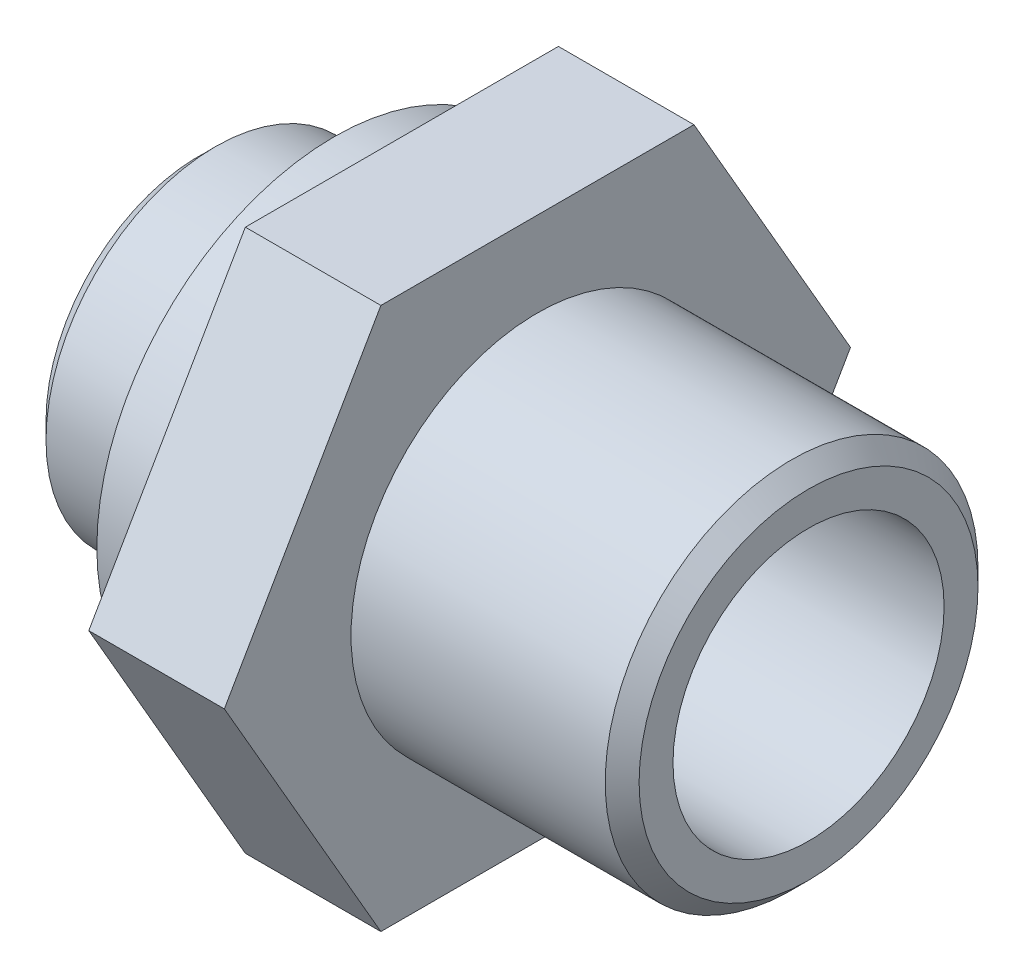
ISO-10303-21;
HEADER;
FILE_DESCRIPTION(('STEP AP214'),'2;1');
FILE_NAME('part.step','',(''),(''),'','','');
FILE_SCHEMA(('AUTOMOTIVE_DESIGN { 1 0 10303 214 1 1 1 1 }'));
ENDSEC;
DATA;
#1=APPLICATION_CONTEXT('core data for automotive mechanical design processes');
#2=APPLICATION_PROTOCOL_DEFINITION('international standard','automotive_design',2000,#1);
#3=PRODUCT_CONTEXT('',#1,'mechanical');
#4=PRODUCT('Part','Part','',(#3));
#5=PRODUCT_RELATED_PRODUCT_CATEGORY('part','',(#4));
#6=PRODUCT_DEFINITION_FORMATION('','',#4);
#7=PRODUCT_DEFINITION_CONTEXT('part definition',#1,'design');
#8=PRODUCT_DEFINITION('design','',#6,#7);
#9=PRODUCT_DEFINITION_SHAPE('','',#8);
#10=(LENGTH_UNIT() NAMED_UNIT(*) SI_UNIT(.MILLI.,.METRE.));
#11=(NAMED_UNIT(*) PLANE_ANGLE_UNIT() SI_UNIT($,.RADIAN.));
#12=(NAMED_UNIT(*) SI_UNIT($,.STERADIAN.) SOLID_ANGLE_UNIT());
#13=UNCERTAINTY_MEASURE_WITH_UNIT(LENGTH_MEASURE(1.E-05),#10,'distance_accuracy_value','');
#14=(GEOMETRIC_REPRESENTATION_CONTEXT(3) GLOBAL_UNCERTAINTY_ASSIGNED_CONTEXT((#13)) GLOBAL_UNIT_ASSIGNED_CONTEXT((#10,
#11,#12)) REPRESENTATION_CONTEXT('',''));
#15=CARTESIAN_POINT('',(0.,0.,0.));
#16=DIRECTION('',(0.,0.,1.));
#17=DIRECTION('',(1.,0.,0.));
#18=AXIS2_PLACEMENT_3D('',#15,#16,#17);
#19=CARTESIAN_POINT('',(4.,0.,0.));
#20=DIRECTION('',(-1.,0.,0.));
#21=DIRECTION('',(0.,0.,1.));
#22=AXIS2_PLACEMENT_3D('',#19,#20,#21);
#23=CYLINDRICAL_SURFACE('',#22,2.75);
#24=CARTESIAN_POINT('',(3.75,0.,0.));
#25=DIRECTION('',(1.,0.,0.));
#26=DIRECTION('',(0.,0.,-1.));
#27=AXIS2_PLACEMENT_3D('',#24,#25,#26);
#28=CIRCLE('',#27,2.75);
#29=CARTESIAN_POINT('',(3.75,0.,-2.75));
#30=VERTEX_POINT('',#29);
#31=EDGE_CURVE('E149',#30,#30,#28,.F.);
#32=ORIENTED_EDGE('',*,*,#31,.T.);
#33=EDGE_LOOP('',(#32));
#34=FACE_BOUND('',#33,.T.);
#35=CARTESIAN_POINT('',(0.,0.,0.));
#36=DIRECTION('',(1.,0.,0.));
#37=DIRECTION('',(0.,0.,-1.));
#38=AXIS2_PLACEMENT_3D('',#35,#36,#37);
#39=CIRCLE('',#38,2.75);
#40=CARTESIAN_POINT('',(0.,0.,-2.75));
#41=VERTEX_POINT('',#40);
#42=EDGE_CURVE('E142',#41,#41,#39,.T.);
#43=ORIENTED_EDGE('',*,*,#42,.T.);
#44=EDGE_LOOP('',(#43));
#45=FACE_BOUND('',#44,.T.);
#46=ADVANCED_FACE('F35',(#34,#45),#23,.T.);
#47=CARTESIAN_POINT('',(4.,0.,0.));
#48=DIRECTION('',(1.,0.,0.));
#49=DIRECTION('',(0.,0.,-1.));
#50=AXIS2_PLACEMENT_3D('',#47,#48,#49);
#51=PLANE('',#50);
#52=CARTESIAN_POINT('',(4.,0.,0.));
#53=DIRECTION('',(1.,0.,0.));
#54=DIRECTION('',(0.,0.,-1.));
#55=AXIS2_PLACEMENT_3D('',#52,#53,#54);
#56=CIRCLE('',#55,2.50000000000001);
#57=CARTESIAN_POINT('',(4.,0.,-2.50000000000001));
#58=VERTEX_POINT('',#57);
#59=EDGE_CURVE('E146',#58,#58,#56,.T.);
#60=ORIENTED_EDGE('',*,*,#59,.T.);
#61=EDGE_LOOP('',(#60));
#62=FACE_BOUND('',#61,.T.);
#63=CARTESIAN_POINT('',(4.,0.,0.));
#64=DIRECTION('',(-1.,0.,0.));
#65=DIRECTION('',(0.,0.,1.));
#66=AXIS2_PLACEMENT_3D('',#63,#64,#65);
#67=CIRCLE('',#66,2.);
#68=CARTESIAN_POINT('',(4.,0.,2.));
#69=VERTEX_POINT('',#68);
#70=EDGE_CURVE('E229',#69,#69,#67,.T.);
#71=ORIENTED_EDGE('',*,*,#70,.T.);
#72=EDGE_LOOP('',(#71));
#73=FACE_BOUND('',#72,.T.);
#74=ADVANCED_FACE('F168',(#62,#73),#51,.T.);
#75=CARTESIAN_POINT('',(-2.,0.,4.61880215351701));
#76=DIRECTION('',(0.,-0.5,-0.866025403784439));
#77=DIRECTION('',(0.,0.866025403784439,-0.5));
#78=AXIS2_PLACEMENT_3D('',#75,#76,#77);
#79=PLANE('',#78);
#80=DIRECTION('',(0.,0.866025403784439,-0.5));
#81=VECTOR('',#80,1.);
#82=CARTESIAN_POINT('',(0.,0.,4.61880215351701));
#83=LINE('',#82,#81);
#84=CARTESIAN_POINT('',(0.,0.,4.61880215351701));
#85=VERTEX_POINT('',#84);
#86=CARTESIAN_POINT('',(0.,4.,2.3094010767585));
#87=VERTEX_POINT('',#86);
#88=EDGE_CURVE('E122',#85,#87,#83,.T.);
#89=ORIENTED_EDGE('',*,*,#88,.T.);
#90=DIRECTION('',(1.,0.,0.));
#91=VECTOR('',#90,1.);
#92=CARTESIAN_POINT('',(-2.,4.,2.3094010767585));
#93=LINE('',#92,#91);
#94=CARTESIAN_POINT('',(-2.,4.,2.3094010767585));
#95=VERTEX_POINT('',#94);
#96=EDGE_CURVE('E140',#95,#87,#93,.T.);
#97=ORIENTED_EDGE('',*,*,#96,.F.);
#98=DIRECTION('',(0.,0.866025403784439,-0.5));
#99=VECTOR('',#98,1.);
#100=CARTESIAN_POINT('',(-2.,0.,4.61880215351701));
#101=LINE('',#100,#99);
#102=CARTESIAN_POINT('',(-2.,0.,4.61880215351701));
#103=VERTEX_POINT('',#102);
#104=EDGE_CURVE('E133',#103,#95,#101,.T.);
#105=ORIENTED_EDGE('',*,*,#104,.F.);
#106=DIRECTION('',(1.,0.,0.));
#107=VECTOR('',#106,1.);
#108=CARTESIAN_POINT('',(-2.,0.,4.61880215351701));
#109=LINE('',#108,#107);
#110=EDGE_CURVE('E118',#103,#85,#109,.T.);
#111=ORIENTED_EDGE('',*,*,#110,.T.);
#112=EDGE_LOOP('',(#89,#97,#105,#111));
#113=FACE_BOUND('',#112,.T.);
#114=ADVANCED_FACE('F174',(#113),#79,.F.);
#115=CARTESIAN_POINT('',(-2.,4.,2.3094010767585));
#116=DIRECTION('',(0.,-1.,0.));
#117=DIRECTION('',(0.,0.,-1.));
#118=AXIS2_PLACEMENT_3D('',#115,#116,#117);
#119=PLANE('',#118);
#120=DIRECTION('',(0.,0.,-1.));
#121=VECTOR('',#120,1.);
#122=CARTESIAN_POINT('',(0.,4.,2.3094010767585));
#123=LINE('',#122,#121);
#124=CARTESIAN_POINT('',(0.,4.,-2.3094010767585));
#125=VERTEX_POINT('',#124);
#126=EDGE_CURVE('E125',#87,#125,#123,.T.);
#127=ORIENTED_EDGE('',*,*,#126,.T.);
#128=DIRECTION('',(1.,0.,0.));
#129=VECTOR('',#128,1.);
#130=CARTESIAN_POINT('',(-2.,4.,-2.3094010767585));
#131=LINE('',#130,#129);
#132=CARTESIAN_POINT('',(-2.,4.,-2.3094010767585));
#133=VERTEX_POINT('',#132);
#134=EDGE_CURVE('E137',#133,#125,#131,.T.);
#135=ORIENTED_EDGE('',*,*,#134,.F.);
#136=DIRECTION('',(0.,0.,-1.));
#137=VECTOR('',#136,1.);
#138=CARTESIAN_POINT('',(-2.,4.,2.3094010767585));
#139=LINE('',#138,#137);
#140=EDGE_CURVE('E91',#95,#133,#139,.T.);
#141=ORIENTED_EDGE('',*,*,#140,.F.);
#142=ORIENTED_EDGE('',*,*,#96,.T.);
#143=EDGE_LOOP('',(#127,#135,#141,#142));
#144=FACE_BOUND('',#143,.T.);
#145=ADVANCED_FACE('F186',(#144),#119,.F.);
#146=CARTESIAN_POINT('',(-2.,4.,-2.3094010767585));
#147=DIRECTION('',(0.,-0.5,0.866025403784438));
#148=DIRECTION('',(0.,-0.866025403784439,-0.5));
#149=AXIS2_PLACEMENT_3D('',#146,#147,#148);
#150=PLANE('',#149);
#151=DIRECTION('',(0.,-0.866025403784439,-0.5));
#152=VECTOR('',#151,1.);
#153=CARTESIAN_POINT('',(0.,4.,-2.3094010767585));
#154=LINE('',#153,#152);
#155=CARTESIAN_POINT('',(0.,0.,-4.61880215351701));
#156=VERTEX_POINT('',#155);
#157=EDGE_CURVE('E128',#125,#156,#154,.T.);
#158=ORIENTED_EDGE('',*,*,#157,.T.);
#159=DIRECTION('',(1.,0.,0.));
#160=VECTOR('',#159,1.);
#161=CARTESIAN_POINT('',(-2.,0.,-4.61880215351701));
#162=LINE('',#161,#160);
#163=CARTESIAN_POINT('',(-2.,0.,-4.61880215351701));
#164=VERTEX_POINT('',#163);
#165=EDGE_CURVE('E113',#164,#156,#162,.T.);
#166=ORIENTED_EDGE('',*,*,#165,.F.);
#167=DIRECTION('',(0.,-0.866025403784439,-0.5));
#168=VECTOR('',#167,1.);
#169=CARTESIAN_POINT('',(-2.,4.,-2.3094010767585));
#170=LINE('',#169,#168);
#171=EDGE_CURVE('E104',#133,#164,#170,.T.);
#172=ORIENTED_EDGE('',*,*,#171,.F.);
#173=ORIENTED_EDGE('',*,*,#134,.T.);
#174=EDGE_LOOP('',(#158,#166,#172,#173));
#175=FACE_BOUND('',#174,.T.);
#176=ADVANCED_FACE('F190',(#175),#150,.F.);
#177=CARTESIAN_POINT('',(-2.,0.,-4.61880215351701));
#178=DIRECTION('',(0.,0.5,0.866025403784439));
#179=DIRECTION('',(0.,-0.866025403784439,0.5));
#180=AXIS2_PLACEMENT_3D('',#177,#178,#179);
#181=PLANE('',#180);
#182=DIRECTION('',(0.,-0.866025403784439,0.5));
#183=VECTOR('',#182,1.);
#184=CARTESIAN_POINT('',(0.,0.,-4.61880215351701));
#185=LINE('',#184,#183);
#186=CARTESIAN_POINT('',(0.,-4.,-2.30940107675851));
#187=VERTEX_POINT('',#186);
#188=EDGE_CURVE('E112',#156,#187,#185,.T.);
#189=ORIENTED_EDGE('',*,*,#188,.T.);
#190=DIRECTION('',(1.,0.,0.));
#191=VECTOR('',#190,1.);
#192=CARTESIAN_POINT('',(-2.,-4.,-2.30940107675851));
#193=LINE('',#192,#191);
#194=CARTESIAN_POINT('',(-2.,-4.,-2.30940107675851));
#195=VERTEX_POINT('',#194);
#196=EDGE_CURVE('E109',#195,#187,#193,.T.);
#197=ORIENTED_EDGE('',*,*,#196,.F.);
#198=DIRECTION('',(0.,-0.866025403784439,0.5));
#199=VECTOR('',#198,1.);
#200=CARTESIAN_POINT('',(-2.,0.,-4.61880215351701));
#201=LINE('',#200,#199);
#202=EDGE_CURVE('E98',#164,#195,#201,.T.);
#203=ORIENTED_EDGE('',*,*,#202,.F.);
#204=ORIENTED_EDGE('',*,*,#165,.T.);
#205=EDGE_LOOP('',(#189,#197,#203,#204));
#206=FACE_BOUND('',#205,.T.);
#207=ADVANCED_FACE('F110',(#206),#181,.F.);
#208=CARTESIAN_POINT('',(-2.,-4.,-2.30940107675851));
#209=DIRECTION('',(0.,1.,0.));
#210=DIRECTION('',(0.,0.,1.));
#211=AXIS2_PLACEMENT_3D('',#208,#209,#210);
#212=PLANE('',#211);
#213=DIRECTION('',(0.,0.,1.));
#214=VECTOR('',#213,1.);
#215=CARTESIAN_POINT('',(0.,-4.,-2.30940107675851));
#216=LINE('',#215,#214);
#217=CARTESIAN_POINT('',(0.,-4.,2.3094010767585));
#218=VERTEX_POINT('',#217);
#219=EDGE_CURVE('E76',#187,#218,#216,.T.);
#220=ORIENTED_EDGE('',*,*,#219,.T.);
#221=DIRECTION('',(1.,0.,0.));
#222=VECTOR('',#221,1.);
#223=CARTESIAN_POINT('',(-2.,-4.,2.3094010767585));
#224=LINE('',#223,#222);
#225=CARTESIAN_POINT('',(-2.,-4.,2.3094010767585));
#226=VERTEX_POINT('',#225);
#227=EDGE_CURVE('E114',#226,#218,#224,.T.);
#228=ORIENTED_EDGE('',*,*,#227,.F.);
#229=DIRECTION('',(0.,0.,1.));
#230=VECTOR('',#229,1.);
#231=CARTESIAN_POINT('',(-2.,-4.,-2.30940107675851));
#232=LINE('',#231,#230);
#233=EDGE_CURVE('E102',#195,#226,#232,.T.);
#234=ORIENTED_EDGE('',*,*,#233,.F.);
#235=ORIENTED_EDGE('',*,*,#196,.T.);
#236=EDGE_LOOP('',(#220,#228,#234,#235));
#237=FACE_BOUND('',#236,.T.);
#238=ADVANCED_FACE('F116',(#237),#212,.F.);
#239=CARTESIAN_POINT('',(-2.,-4.,2.3094010767585));
#240=DIRECTION('',(0.,0.5,-0.866025403784438));
#241=DIRECTION('',(0.,0.866025403784439,0.5));
#242=AXIS2_PLACEMENT_3D('',#239,#240,#241);
#243=PLANE('',#242);
#244=DIRECTION('',(0.,0.866025403784439,0.5));
#245=VECTOR('',#244,1.);
#246=CARTESIAN_POINT('',(0.,-4.,2.3094010767585));
#247=LINE('',#246,#245);
#248=EDGE_CURVE('E82',#218,#85,#247,.T.);
#249=ORIENTED_EDGE('',*,*,#248,.T.);
#250=ORIENTED_EDGE('',*,*,#110,.F.);
#251=DIRECTION('',(0.,0.866025403784439,0.5));
#252=VECTOR('',#251,1.);
#253=CARTESIAN_POINT('',(-2.,-4.,2.3094010767585));
#254=LINE('',#253,#252);
#255=EDGE_CURVE('E53',#226,#103,#254,.T.);
#256=ORIENTED_EDGE('',*,*,#255,.F.);
#257=ORIENTED_EDGE('',*,*,#227,.T.);
#258=EDGE_LOOP('',(#249,#250,#256,#257));
#259=FACE_BOUND('',#258,.T.);
#260=ADVANCED_FACE('F198',(#259),#243,.F.);
#261=CARTESIAN_POINT('',(-2.,0.,0.));
#262=DIRECTION('',(-1.,0.,0.));
#263=DIRECTION('',(0.,0.,1.));
#264=AXIS2_PLACEMENT_3D('',#261,#262,#263);
#265=PLANE('',#264);
#266=CARTESIAN_POINT('',(-2.,0.,0.));
#267=DIRECTION('',(-1.,0.,0.));
#268=DIRECTION('',(0.,0.,1.));
#269=AXIS2_PLACEMENT_3D('',#266,#267,#268);
#270=CIRCLE('',#269,3.5);
#271=CARTESIAN_POINT('',(-2.,0.,3.5));
#272=VERTEX_POINT('',#271);
#273=EDGE_CURVE('E145',#272,#272,#270,.T.);
#274=ORIENTED_EDGE('',*,*,#273,.F.);
#275=EDGE_LOOP('',(#274));
#276=FACE_BOUND('',#275,.T.);
#277=ORIENTED_EDGE('',*,*,#104,.T.);
#278=ORIENTED_EDGE('',*,*,#140,.T.);
#279=ORIENTED_EDGE('',*,*,#171,.T.);
#280=ORIENTED_EDGE('',*,*,#202,.T.);
#281=ORIENTED_EDGE('',*,*,#233,.T.);
#282=ORIENTED_EDGE('',*,*,#255,.T.);
#283=EDGE_LOOP('',(#277,#278,#279,#280,#281,#282));
#284=FACE_BOUND('',#283,.T.);
#285=ADVANCED_FACE('F100',(#276,#284),#265,.T.);
#286=CARTESIAN_POINT('',(0.,0.,0.));
#287=DIRECTION('',(-1.,0.,0.));
#288=DIRECTION('',(0.,0.,1.));
#289=AXIS2_PLACEMENT_3D('',#286,#287,#288);
#290=PLANE('',#289);
#291=ORIENTED_EDGE('',*,*,#42,.F.);
#292=EDGE_LOOP('',(#291));
#293=FACE_BOUND('',#292,.T.);
#294=ORIENTED_EDGE('',*,*,#88,.F.);
#295=ORIENTED_EDGE('',*,*,#248,.F.);
#296=ORIENTED_EDGE('',*,*,#219,.F.);
#297=ORIENTED_EDGE('',*,*,#188,.F.);
#298=ORIENTED_EDGE('',*,*,#157,.F.);
#299=ORIENTED_EDGE('',*,*,#126,.F.);
#300=EDGE_LOOP('',(#294,#295,#296,#297,#298,#299));
#301=FACE_BOUND('',#300,.T.);
#302=ADVANCED_FACE('F201',(#293,#301),#290,.F.);
#303=CARTESIAN_POINT('',(-3.,0.,0.));
#304=DIRECTION('',(1.,0.,0.));
#305=DIRECTION('',(0.,0.,-1.));
#306=AXIS2_PLACEMENT_3D('',#303,#304,#305);
#307=CYLINDRICAL_SURFACE('',#306,3.5);
#308=CARTESIAN_POINT('',(-3.,0.,0.));
#309=DIRECTION('',(-1.,0.,0.));
#310=DIRECTION('',(0.,0.,1.));
#311=AXIS2_PLACEMENT_3D('',#308,#309,#310);
#312=CIRCLE('',#311,3.5);
#313=CARTESIAN_POINT('',(-3.,0.,3.5));
#314=VERTEX_POINT('',#313);
#315=EDGE_CURVE('E126',#314,#314,#312,.T.);
#316=ORIENTED_EDGE('',*,*,#315,.F.);
#317=EDGE_LOOP('',(#316));
#318=FACE_BOUND('',#317,.T.);
#319=ORIENTED_EDGE('',*,*,#273,.T.);
#320=EDGE_LOOP('',(#319));
#321=FACE_BOUND('',#320,.T.);
#322=ADVANCED_FACE('F204',(#318,#321),#307,.T.);
#323=CARTESIAN_POINT('',(-3.,0.,0.));
#324=DIRECTION('',(-1.,0.,0.));
#325=DIRECTION('',(0.,0.,1.));
#326=AXIS2_PLACEMENT_3D('',#323,#324,#325);
#327=PLANE('',#326);
#328=CARTESIAN_POINT('',(-3.,0.,0.));
#329=DIRECTION('',(-1.,0.,0.));
#330=DIRECTION('',(0.,0.,1.));
#331=AXIS2_PLACEMENT_3D('',#328,#329,#330);
#332=CIRCLE('',#331,2.5);
#333=CARTESIAN_POINT('',(-3.,0.,2.5));
#334=VERTEX_POINT('',#333);
#335=EDGE_CURVE('E150',#334,#334,#332,.T.);
#336=ORIENTED_EDGE('',*,*,#335,.F.);
#337=EDGE_LOOP('',(#336));
#338=FACE_BOUND('',#337,.T.);
#339=ORIENTED_EDGE('',*,*,#315,.T.);
#340=EDGE_LOOP('',(#339));
#341=FACE_BOUND('',#340,.T.);
#342=ADVANCED_FACE('F211',(#338,#341),#327,.T.);
#343=CARTESIAN_POINT('',(-5.,0.,0.));
#344=DIRECTION('',(1.,0.,0.));
#345=DIRECTION('',(0.,0.,-1.));
#346=AXIS2_PLACEMENT_3D('',#343,#344,#345);
#347=CYLINDRICAL_SURFACE('',#346,2.5);
#348=CARTESIAN_POINT('',(-4.75,0.,0.));
#349=DIRECTION('',(-1.,0.,0.));
#350=DIRECTION('',(0.,0.,1.));
#351=AXIS2_PLACEMENT_3D('',#348,#349,#350);
#352=CIRCLE('',#351,2.5);
#353=CARTESIAN_POINT('',(-4.75,0.,2.5));
#354=VERTEX_POINT('',#353);
#355=EDGE_CURVE('E11',#354,#354,#352,.F.);
#356=ORIENTED_EDGE('',*,*,#355,.T.);
#357=EDGE_LOOP('',(#356));
#358=FACE_BOUND('',#357,.T.);
#359=ORIENTED_EDGE('',*,*,#335,.T.);
#360=EDGE_LOOP('',(#359));
#361=FACE_BOUND('',#360,.T.);
#362=ADVANCED_FACE('F215',(#358,#361),#347,.T.);
#363=CARTESIAN_POINT('',(-5.,0.,0.));
#364=DIRECTION('',(-1.,0.,0.));
#365=DIRECTION('',(0.,0.,1.));
#366=AXIS2_PLACEMENT_3D('',#363,#364,#365);
#367=PLANE('',#366);
#368=CARTESIAN_POINT('',(-5.,0.,0.));
#369=DIRECTION('',(-1.,0.,0.));
#370=DIRECTION('',(0.,0.,1.));
#371=AXIS2_PLACEMENT_3D('',#368,#369,#370);
#372=CIRCLE('',#371,2.25);
#373=CARTESIAN_POINT('',(-5.,0.,2.25));
#374=VERTEX_POINT('',#373);
#375=EDGE_CURVE('E45',#374,#374,#372,.T.);
#376=ORIENTED_EDGE('',*,*,#375,.T.);
#377=EDGE_LOOP('',(#376));
#378=FACE_BOUND('',#377,.T.);
#379=CARTESIAN_POINT('',(-5.,0.,0.));
#380=DIRECTION('',(-1.,0.,0.));
#381=DIRECTION('',(0.,0.,1.));
#382=AXIS2_PLACEMENT_3D('',#379,#380,#381);
#383=CIRCLE('',#382,2.);
#384=CARTESIAN_POINT('',(-5.,0.,2.));
#385=VERTEX_POINT('',#384);
#386=EDGE_CURVE('E232',#385,#385,#383,.T.);
#387=ORIENTED_EDGE('',*,*,#386,.F.);
#388=EDGE_LOOP('',(#387));
#389=FACE_BOUND('',#388,.T.);
#390=ADVANCED_FACE('F155',(#378,#389),#367,.T.);
#391=CARTESIAN_POINT('',(4.,0.,0.));
#392=DIRECTION('',(-1.,0.,0.));
#393=DIRECTION('',(0.,0.,1.));
#394=AXIS2_PLACEMENT_3D('',#391,#392,#393);
#395=CYLINDRICAL_SURFACE('',#394,2.);
#396=ORIENTED_EDGE('',*,*,#70,.F.);
#397=EDGE_LOOP('',(#396));
#398=FACE_BOUND('',#397,.T.);
#399=ORIENTED_EDGE('',*,*,#386,.T.);
#400=EDGE_LOOP('',(#399));
#401=FACE_BOUND('',#400,.T.);
#402=ADVANCED_FACE('F164',(#398,#401),#395,.F.);
#403=CARTESIAN_POINT('',(4.,0.,0.));
#404=DIRECTION('',(-1.,0.,0.));
#405=DIRECTION('',(0.,0.,1.));
#406=AXIS2_PLACEMENT_3D('',#403,#404,#405);
#407=CONICAL_SURFACE('',#406,2.50000000000001,0.785398163397447);
#408=ORIENTED_EDGE('',*,*,#31,.F.);
#409=EDGE_LOOP('',(#408));
#410=FACE_BOUND('',#409,.T.);
#411=ORIENTED_EDGE('',*,*,#59,.F.);
#412=EDGE_LOOP('',(#411));
#413=FACE_BOUND('',#412,.T.);
#414=ADVANCED_FACE('F159',(#410,#413),#407,.T.);
#415=CARTESIAN_POINT('',(-5.,0.,0.));
#416=DIRECTION('',(1.,0.,0.));
#417=DIRECTION('',(0.,0.,-1.));
#418=AXIS2_PLACEMENT_3D('',#415,#416,#417);
#419=CONICAL_SURFACE('',#418,2.25,0.785398163397446);
#420=ORIENTED_EDGE('',*,*,#355,.F.);
#421=EDGE_LOOP('',(#420));
#422=FACE_BOUND('',#421,.T.);
#423=ORIENTED_EDGE('',*,*,#375,.F.);
#424=EDGE_LOOP('',(#423));
#425=FACE_BOUND('',#424,.T.);
#426=ADVANCED_FACE('F38',(#422,#425),#419,.T.);
#427=CLOSED_SHELL('',(#46,#74,#114,#145,#176,#207,#238,#260,#285,#302,#322,#342,#362,#390,#402,
#414,#426));
#428=MANIFOLD_SOLID_BREP('B2',#427);
#429=ADVANCED_BREP_SHAPE_REPRESENTATION('',(#18,#428),#14);
#430=SHAPE_DEFINITION_REPRESENTATION(#9,#429);
ENDSEC;
END-ISO-10303-21;
